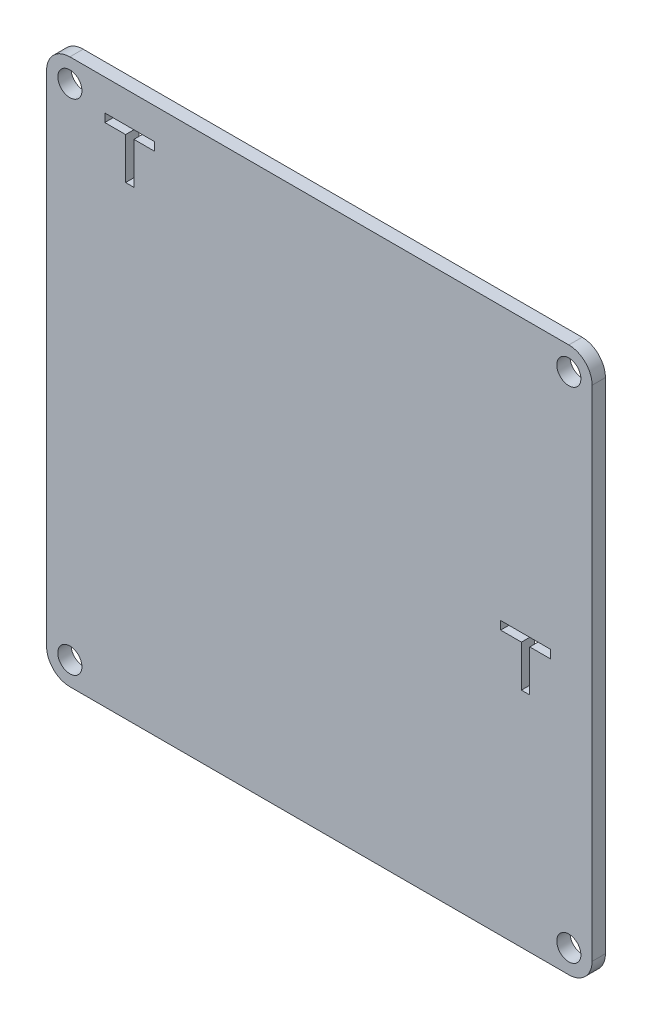
ISO-10303-21;
HEADER;
FILE_DESCRIPTION(('STEP AP214'),'2;1');
FILE_NAME('part.step','',(''),(''),'','','');
FILE_SCHEMA(('AUTOMOTIVE_DESIGN { 1 0 10303 214 1 1 1 1 }'));
ENDSEC;
DATA;
#1=APPLICATION_CONTEXT('core data for automotive mechanical design processes');
#2=APPLICATION_PROTOCOL_DEFINITION('international standard','automotive_design',2000,#1);
#3=PRODUCT_CONTEXT('',#1,'mechanical');
#4=PRODUCT('Part','Part','',(#3));
#5=PRODUCT_RELATED_PRODUCT_CATEGORY('part','',(#4));
#6=PRODUCT_DEFINITION_FORMATION('','',#4);
#7=PRODUCT_DEFINITION_CONTEXT('part definition',#1,'design');
#8=PRODUCT_DEFINITION('design','',#6,#7);
#9=PRODUCT_DEFINITION_SHAPE('','',#8);
#10=(LENGTH_UNIT() NAMED_UNIT(*) SI_UNIT(.MILLI.,.METRE.));
#11=(NAMED_UNIT(*) PLANE_ANGLE_UNIT() SI_UNIT($,.RADIAN.));
#12=(NAMED_UNIT(*) SI_UNIT($,.STERADIAN.) SOLID_ANGLE_UNIT());
#13=UNCERTAINTY_MEASURE_WITH_UNIT(LENGTH_MEASURE(1.E-05),#10,'distance_accuracy_value','');
#14=(GEOMETRIC_REPRESENTATION_CONTEXT(3) GLOBAL_UNCERTAINTY_ASSIGNED_CONTEXT((#13)) GLOBAL_UNIT_ASSIGNED_CONTEXT((#10,
#11,#12)) REPRESENTATION_CONTEXT('',''));
#15=CARTESIAN_POINT('',(0.,0.,0.));
#16=DIRECTION('',(0.,0.,1.));
#17=DIRECTION('',(1.,0.,0.));
#18=AXIS2_PLACEMENT_3D('',#15,#16,#17);
#19=CARTESIAN_POINT('',(30.,30.,1.6));
#20=DIRECTION('',(0.,0.,-1.));
#21=DIRECTION('',(-1.,0.,0.));
#22=AXIS2_PLACEMENT_3D('',#19,#20,#21);
#23=PLANE('',#22);
#24=DIRECTION('',(1.,0.,0.));
#25=VECTOR('',#24,1.);
#26=CARTESIAN_POINT('',(21.8,-1.,1.6));
#27=LINE('',#26,#25);
#28=CARTESIAN_POINT('',(21.8,-1.,1.6));
#29=VERTEX_POINT('',#28);
#30=CARTESIAN_POINT('',(24.3,-1.,1.6));
#31=VERTEX_POINT('',#30);
#32=EDGE_CURVE('E241',#29,#31,#27,.T.);
#33=ORIENTED_EDGE('',*,*,#32,.F.);
#34=DIRECTION('',(0.,-1.,0.));
#35=VECTOR('',#34,1.);
#36=CARTESIAN_POINT('',(21.8,0.,1.6));
#37=LINE('',#36,#35);
#38=CARTESIAN_POINT('',(21.8,0.,1.6));
#39=VERTEX_POINT('',#38);
#40=EDGE_CURVE('E56',#39,#29,#37,.T.);
#41=ORIENTED_EDGE('',*,*,#40,.F.);
#42=DIRECTION('',(-1.,0.,0.));
#43=VECTOR('',#42,1.);
#44=CARTESIAN_POINT('',(21.8,0.,1.6));
#45=LINE('',#44,#43);
#46=CARTESIAN_POINT('',(27.8,0.,1.6));
#47=VERTEX_POINT('',#46);
#48=EDGE_CURVE('E221',#47,#39,#45,.T.);
#49=ORIENTED_EDGE('',*,*,#48,.F.);
#50=DIRECTION('',(0.,1.,0.));
#51=VECTOR('',#50,1.);
#52=CARTESIAN_POINT('',(27.8,0.,1.6));
#53=LINE('',#52,#51);
#54=CARTESIAN_POINT('',(27.8,-1.,1.6));
#55=VERTEX_POINT('',#54);
#56=EDGE_CURVE('E224',#55,#47,#53,.T.);
#57=ORIENTED_EDGE('',*,*,#56,.F.);
#58=DIRECTION('',(1.,0.,0.));
#59=VECTOR('',#58,1.);
#60=CARTESIAN_POINT('',(25.3,-1.,1.6));
#61=LINE('',#60,#59);
#62=CARTESIAN_POINT('',(25.3,-1.,1.6));
#63=VERTEX_POINT('',#62);
#64=EDGE_CURVE('E252',#63,#55,#61,.T.);
#65=ORIENTED_EDGE('',*,*,#64,.F.);
#66=DIRECTION('',(0.,1.,0.));
#67=VECTOR('',#66,1.);
#68=CARTESIAN_POINT('',(25.3,-1.,1.6));
#69=LINE('',#68,#67);
#70=CARTESIAN_POINT('',(25.3,-6.,1.6));
#71=VERTEX_POINT('',#70);
#72=EDGE_CURVE('E249',#71,#63,#69,.T.);
#73=ORIENTED_EDGE('',*,*,#72,.F.);
#74=DIRECTION('',(1.,0.,0.));
#75=VECTOR('',#74,1.);
#76=CARTESIAN_POINT('',(24.3,-6.,1.6));
#77=LINE('',#76,#75);
#78=CARTESIAN_POINT('',(24.3,-6.,1.6));
#79=VERTEX_POINT('',#78);
#80=EDGE_CURVE('E246',#79,#71,#77,.T.);
#81=ORIENTED_EDGE('',*,*,#80,.F.);
#82=DIRECTION('',(0.,-1.,0.));
#83=VECTOR('',#82,1.);
#84=CARTESIAN_POINT('',(24.3,-1.,1.6));
#85=LINE('',#84,#83);
#86=EDGE_CURVE('E243',#31,#79,#85,.T.);
#87=ORIENTED_EDGE('',*,*,#86,.F.);
#88=EDGE_LOOP('',(#33,#41,#49,#57,#65,#73,#81,#87));
#89=FACE_BOUND('',#88,.T.);
#90=DIRECTION('',(1.,0.,0.));
#91=VECTOR('',#90,1.);
#92=CARTESIAN_POINT('',(-25.8,28.06,1.6));
#93=LINE('',#92,#91);
#94=CARTESIAN_POINT('',(-25.8,28.06,1.6));
#95=VERTEX_POINT('',#94);
#96=CARTESIAN_POINT('',(-23.3,28.06,1.6));
#97=VERTEX_POINT('',#96);
#98=EDGE_CURVE('E298',#95,#97,#93,.T.);
#99=ORIENTED_EDGE('',*,*,#98,.F.);
#100=DIRECTION('',(0.,-1.,0.));
#101=VECTOR('',#100,1.);
#102=CARTESIAN_POINT('',(-25.8,29.06,1.6));
#103=LINE('',#102,#101);
#104=CARTESIAN_POINT('',(-25.8,29.06,1.6));
#105=VERTEX_POINT('',#104);
#106=EDGE_CURVE('E259',#105,#95,#103,.T.);
#107=ORIENTED_EDGE('',*,*,#106,.F.);
#108=DIRECTION('',(-1.,0.,0.));
#109=VECTOR('',#108,1.);
#110=CARTESIAN_POINT('',(-25.8,29.06,1.6));
#111=LINE('',#110,#109);
#112=CARTESIAN_POINT('',(-19.8,29.06,1.6));
#113=VERTEX_POINT('',#112);
#114=EDGE_CURVE('E275',#113,#105,#111,.T.);
#115=ORIENTED_EDGE('',*,*,#114,.F.);
#116=DIRECTION('',(0.,1.,0.));
#117=VECTOR('',#116,1.);
#118=CARTESIAN_POINT('',(-19.8,29.06,1.6));
#119=LINE('',#118,#117);
#120=CARTESIAN_POINT('',(-19.8,28.06,1.6));
#121=VERTEX_POINT('',#120);
#122=EDGE_CURVE('E313',#121,#113,#119,.T.);
#123=ORIENTED_EDGE('',*,*,#122,.F.);
#124=DIRECTION('',(1.,0.,0.));
#125=VECTOR('',#124,1.);
#126=CARTESIAN_POINT('',(-22.3,28.06,1.6));
#127=LINE('',#126,#125);
#128=CARTESIAN_POINT('',(-22.3,28.06,1.6));
#129=VERTEX_POINT('',#128);
#130=EDGE_CURVE('E310',#129,#121,#127,.T.);
#131=ORIENTED_EDGE('',*,*,#130,.F.);
#132=DIRECTION('',(0.,1.,0.));
#133=VECTOR('',#132,1.);
#134=CARTESIAN_POINT('',(-22.3,28.06,1.6));
#135=LINE('',#134,#133);
#136=CARTESIAN_POINT('',(-22.3,23.06,1.6));
#137=VERTEX_POINT('',#136);
#138=EDGE_CURVE('E307',#137,#129,#135,.T.);
#139=ORIENTED_EDGE('',*,*,#138,.F.);
#140=DIRECTION('',(1.,0.,0.));
#141=VECTOR('',#140,1.);
#142=CARTESIAN_POINT('',(-23.3,23.06,1.6));
#143=LINE('',#142,#141);
#144=CARTESIAN_POINT('',(-23.3,23.06,1.6));
#145=VERTEX_POINT('',#144);
#146=EDGE_CURVE('E304',#145,#137,#143,.T.);
#147=ORIENTED_EDGE('',*,*,#146,.F.);
#148=DIRECTION('',(0.,-1.,0.));
#149=VECTOR('',#148,1.);
#150=CARTESIAN_POINT('',(-23.3,28.06,1.6));
#151=LINE('',#150,#149);
#152=EDGE_CURVE('E301',#97,#145,#151,.T.);
#153=ORIENTED_EDGE('',*,*,#152,.F.);
#154=EDGE_LOOP('',(#99,#107,#115,#123,#131,#139,#147,#153));
#155=FACE_BOUND('',#154,.T.);
#156=CARTESIAN_POINT('',(30.,30.,1.6));
#157=DIRECTION('',(0.,0.,1.));
#158=DIRECTION('',(-1.,0.,0.));
#159=AXIS2_PLACEMENT_3D('',#156,#157,#158);
#160=CIRCLE('',#159,2.8);
#161=CARTESIAN_POINT('',(32.8,30.,1.6));
#162=VERTEX_POINT('',#161);
#163=CARTESIAN_POINT('',(30.,32.8,1.6));
#164=VERTEX_POINT('',#163);
#165=EDGE_CURVE('E359',#162,#164,#160,.T.);
#166=ORIENTED_EDGE('',*,*,#165,.T.);
#167=DIRECTION('',(-1.,0.,0.));
#168=VECTOR('',#167,1.);
#169=CARTESIAN_POINT('',(-30.,32.8,1.6));
#170=LINE('',#169,#168);
#171=CARTESIAN_POINT('',(-30.,32.8,1.6));
#172=VERTEX_POINT('',#171);
#173=EDGE_CURVE('E362',#164,#172,#170,.T.);
#174=ORIENTED_EDGE('',*,*,#173,.T.);
#175=CARTESIAN_POINT('',(-30.,30.,1.6));
#176=DIRECTION('',(0.,0.,1.));
#177=DIRECTION('',(-1.,0.,0.));
#178=AXIS2_PLACEMENT_3D('',#175,#176,#177);
#179=CIRCLE('',#178,2.8);
#180=CARTESIAN_POINT('',(-32.8,30.,1.6));
#181=VERTEX_POINT('',#180);
#182=EDGE_CURVE('E365',#172,#181,#179,.T.);
#183=ORIENTED_EDGE('',*,*,#182,.T.);
#184=DIRECTION('',(0.,-1.,0.));
#185=VECTOR('',#184,1.);
#186=CARTESIAN_POINT('',(-32.8,-30.,1.6));
#187=LINE('',#186,#185);
#188=CARTESIAN_POINT('',(-32.8,-30.,1.6));
#189=VERTEX_POINT('',#188);
#190=EDGE_CURVE('E367',#181,#189,#187,.T.);
#191=ORIENTED_EDGE('',*,*,#190,.T.);
#192=CARTESIAN_POINT('',(-30.,-30.,1.6));
#193=DIRECTION('',(0.,0.,1.));
#194=DIRECTION('',(-1.,0.,0.));
#195=AXIS2_PLACEMENT_3D('',#192,#193,#194);
#196=CIRCLE('',#195,2.79999999999999);
#197=CARTESIAN_POINT('',(-30.,-32.8,1.6));
#198=VERTEX_POINT('',#197);
#199=EDGE_CURVE('E369',#189,#198,#196,.T.);
#200=ORIENTED_EDGE('',*,*,#199,.T.);
#201=DIRECTION('',(1.,0.,0.));
#202=VECTOR('',#201,1.);
#203=CARTESIAN_POINT('',(30.,-32.8,1.6));
#204=LINE('',#203,#202);
#205=CARTESIAN_POINT('',(30.,-32.8,1.6));
#206=VERTEX_POINT('',#205);
#207=EDGE_CURVE('E371',#198,#206,#204,.T.);
#208=ORIENTED_EDGE('',*,*,#207,.T.);
#209=CARTESIAN_POINT('',(30.,-30.,1.6));
#210=DIRECTION('',(0.,0.,1.));
#211=DIRECTION('',(-1.,0.,0.));
#212=AXIS2_PLACEMENT_3D('',#209,#210,#211);
#213=CIRCLE('',#212,2.79999999999998);
#214=CARTESIAN_POINT('',(32.8,-30.,1.6));
#215=VERTEX_POINT('',#214);
#216=EDGE_CURVE('E373',#206,#215,#213,.T.);
#217=ORIENTED_EDGE('',*,*,#216,.T.);
#218=DIRECTION('',(0.,1.,0.));
#219=VECTOR('',#218,1.);
#220=CARTESIAN_POINT('',(32.8,30.,1.6));
#221=LINE('',#220,#219);
#222=EDGE_CURVE('E375',#215,#162,#221,.T.);
#223=ORIENTED_EDGE('',*,*,#222,.T.);
#224=EDGE_LOOP('',(#166,#174,#183,#191,#200,#208,#217,#223));
#225=FACE_BOUND('',#224,.T.);
#226=CARTESIAN_POINT('',(-30.,30.,1.6));
#227=DIRECTION('',(0.,0.,1.));
#228=DIRECTION('',(1.,0.,0.));
#229=AXIS2_PLACEMENT_3D('',#226,#227,#228);
#230=CIRCLE('',#229,1.45000000000001);
#231=CARTESIAN_POINT('',(-28.55,30.,1.6));
#232=VERTEX_POINT('',#231);
#233=EDGE_CURVE('E353',#232,#232,#230,.T.);
#234=ORIENTED_EDGE('',*,*,#233,.F.);
#235=EDGE_LOOP('',(#234));
#236=FACE_BOUND('',#235,.T.);
#237=CARTESIAN_POINT('',(30.,30.,1.6));
#238=DIRECTION('',(0.,0.,1.));
#239=DIRECTION('',(1.,0.,0.));
#240=AXIS2_PLACEMENT_3D('',#237,#238,#239);
#241=CIRCLE('',#240,1.45);
#242=CARTESIAN_POINT('',(31.45,30.,1.6));
#243=VERTEX_POINT('',#242);
#244=EDGE_CURVE('E347',#243,#243,#241,.T.);
#245=ORIENTED_EDGE('',*,*,#244,.F.);
#246=EDGE_LOOP('',(#245));
#247=FACE_BOUND('',#246,.T.);
#248=CARTESIAN_POINT('',(-30.,-30.,1.6));
#249=DIRECTION('',(0.,0.,1.));
#250=DIRECTION('',(1.,0.,0.));
#251=AXIS2_PLACEMENT_3D('',#248,#249,#250);
#252=CIRCLE('',#251,1.44999999999999);
#253=CARTESIAN_POINT('',(-28.55,-30.,1.6));
#254=VERTEX_POINT('',#253);
#255=EDGE_CURVE('E341',#254,#254,#252,.T.);
#256=ORIENTED_EDGE('',*,*,#255,.F.);
#257=EDGE_LOOP('',(#256));
#258=FACE_BOUND('',#257,.T.);
#259=CARTESIAN_POINT('',(30.,-30.,1.6));
#260=DIRECTION('',(0.,0.,1.));
#261=DIRECTION('',(1.,0.,0.));
#262=AXIS2_PLACEMENT_3D('',#259,#260,#261);
#263=CIRCLE('',#262,1.45);
#264=CARTESIAN_POINT('',(31.45,-30.,1.6));
#265=VERTEX_POINT('',#264);
#266=EDGE_CURVE('E335',#265,#265,#263,.T.);
#267=ORIENTED_EDGE('',*,*,#266,.F.);
#268=EDGE_LOOP('',(#267));
#269=FACE_BOUND('',#268,.T.);
#270=ADVANCED_FACE('F41',(#89,#155,#225,#236,#247,#258,#269),#23,.F.);
#271=CARTESIAN_POINT('',(30.,30.,0.));
#272=DIRECTION('',(0.,0.,-1.));
#273=DIRECTION('',(-1.,0.,0.));
#274=AXIS2_PLACEMENT_3D('',#271,#272,#273);
#275=PLANE('',#274);
#276=DIRECTION('',(0.,-1.,0.));
#277=VECTOR('',#276,1.);
#278=CARTESIAN_POINT('',(21.8,0.,0.));
#279=LINE('',#278,#277);
#280=CARTESIAN_POINT('',(21.8,0.,0.));
#281=VERTEX_POINT('',#280);
#282=CARTESIAN_POINT('',(21.8,-1.,0.));
#283=VERTEX_POINT('',#282);
#284=EDGE_CURVE('E204',#281,#283,#279,.T.);
#285=ORIENTED_EDGE('',*,*,#284,.T.);
#286=DIRECTION('',(1.,0.,0.));
#287=VECTOR('',#286,1.);
#288=CARTESIAN_POINT('',(21.8,-1.,0.));
#289=LINE('',#288,#287);
#290=CARTESIAN_POINT('',(24.3,-1.,0.));
#291=VERTEX_POINT('',#290);
#292=EDGE_CURVE('E213',#283,#291,#289,.T.);
#293=ORIENTED_EDGE('',*,*,#292,.T.);
#294=DIRECTION('',(0.,-1.,0.));
#295=VECTOR('',#294,1.);
#296=CARTESIAN_POINT('',(24.3,-1.,0.));
#297=LINE('',#296,#295);
#298=CARTESIAN_POINT('',(24.3,-6.,0.));
#299=VERTEX_POINT('',#298);
#300=EDGE_CURVE('E64',#291,#299,#297,.T.);
#301=ORIENTED_EDGE('',*,*,#300,.T.);
#302=DIRECTION('',(1.,0.,0.));
#303=VECTOR('',#302,1.);
#304=CARTESIAN_POINT('',(24.3,-6.,0.));
#305=LINE('',#304,#303);
#306=CARTESIAN_POINT('',(25.3,-6.,0.));
#307=VERTEX_POINT('',#306);
#308=EDGE_CURVE('E228',#299,#307,#305,.T.);
#309=ORIENTED_EDGE('',*,*,#308,.T.);
#310=DIRECTION('',(0.,1.,0.));
#311=VECTOR('',#310,1.);
#312=CARTESIAN_POINT('',(25.3,-1.,0.));
#313=LINE('',#312,#311);
#314=CARTESIAN_POINT('',(25.3,-1.,0.));
#315=VERTEX_POINT('',#314);
#316=EDGE_CURVE('E231',#307,#315,#313,.T.);
#317=ORIENTED_EDGE('',*,*,#316,.T.);
#318=DIRECTION('',(1.,0.,0.));
#319=VECTOR('',#318,1.);
#320=CARTESIAN_POINT('',(25.3,-1.,0.));
#321=LINE('',#320,#319);
#322=CARTESIAN_POINT('',(27.8,-1.,0.));
#323=VERTEX_POINT('',#322);
#324=EDGE_CURVE('E234',#315,#323,#321,.T.);
#325=ORIENTED_EDGE('',*,*,#324,.T.);
#326=DIRECTION('',(0.,1.,0.));
#327=VECTOR('',#326,1.);
#328=CARTESIAN_POINT('',(27.8,0.,0.));
#329=LINE('',#328,#327);
#330=CARTESIAN_POINT('',(27.8,0.,0.));
#331=VERTEX_POINT('',#330);
#332=EDGE_CURVE('E237',#323,#331,#329,.T.);
#333=ORIENTED_EDGE('',*,*,#332,.T.);
#334=DIRECTION('',(-1.,0.,0.));
#335=VECTOR('',#334,1.);
#336=CARTESIAN_POINT('',(21.8,0.,0.));
#337=LINE('',#336,#335);
#338=EDGE_CURVE('E210',#331,#281,#337,.T.);
#339=ORIENTED_EDGE('',*,*,#338,.T.);
#340=EDGE_LOOP('',(#285,#293,#301,#309,#317,#325,#333,#339));
#341=FACE_BOUND('',#340,.T.);
#342=DIRECTION('',(0.,-1.,0.));
#343=VECTOR('',#342,1.);
#344=CARTESIAN_POINT('',(-25.8,29.06,0.));
#345=LINE('',#344,#343);
#346=CARTESIAN_POINT('',(-25.8,29.06,0.));
#347=VERTEX_POINT('',#346);
#348=CARTESIAN_POINT('',(-25.8,28.06,0.));
#349=VERTEX_POINT('',#348);
#350=EDGE_CURVE('E271',#347,#349,#345,.T.);
#351=ORIENTED_EDGE('',*,*,#350,.T.);
#352=DIRECTION('',(1.,0.,0.));
#353=VECTOR('',#352,1.);
#354=CARTESIAN_POINT('',(-25.8,28.06,0.));
#355=LINE('',#354,#353);
#356=CARTESIAN_POINT('',(-23.3,28.06,0.));
#357=VERTEX_POINT('',#356);
#358=EDGE_CURVE('E274',#349,#357,#355,.T.);
#359=ORIENTED_EDGE('',*,*,#358,.T.);
#360=DIRECTION('',(0.,-1.,0.));
#361=VECTOR('',#360,1.);
#362=CARTESIAN_POINT('',(-23.3,28.06,0.));
#363=LINE('',#362,#361);
#364=CARTESIAN_POINT('',(-23.3,23.06,0.));
#365=VERTEX_POINT('',#364);
#366=EDGE_CURVE('E278',#357,#365,#363,.T.);
#367=ORIENTED_EDGE('',*,*,#366,.T.);
#368=DIRECTION('',(1.,0.,0.));
#369=VECTOR('',#368,1.);
#370=CARTESIAN_POINT('',(-23.3,23.06,0.));
#371=LINE('',#370,#369);
#372=CARTESIAN_POINT('',(-22.3,23.06,0.));
#373=VERTEX_POINT('',#372);
#374=EDGE_CURVE('E281',#365,#373,#371,.T.);
#375=ORIENTED_EDGE('',*,*,#374,.T.);
#376=DIRECTION('',(0.,1.,0.));
#377=VECTOR('',#376,1.);
#378=CARTESIAN_POINT('',(-22.3,28.06,0.));
#379=LINE('',#378,#377);
#380=CARTESIAN_POINT('',(-22.3,28.06,0.));
#381=VERTEX_POINT('',#380);
#382=EDGE_CURVE('E284',#373,#381,#379,.T.);
#383=ORIENTED_EDGE('',*,*,#382,.T.);
#384=DIRECTION('',(1.,0.,0.));
#385=VECTOR('',#384,1.);
#386=CARTESIAN_POINT('',(-22.3,28.06,0.));
#387=LINE('',#386,#385);
#388=CARTESIAN_POINT('',(-19.8,28.06,0.));
#389=VERTEX_POINT('',#388);
#390=EDGE_CURVE('E287',#381,#389,#387,.T.);
#391=ORIENTED_EDGE('',*,*,#390,.T.);
#392=DIRECTION('',(0.,1.,0.));
#393=VECTOR('',#392,1.);
#394=CARTESIAN_POINT('',(-19.8,29.06,0.));
#395=LINE('',#394,#393);
#396=CARTESIAN_POINT('',(-19.8,29.06,0.));
#397=VERTEX_POINT('',#396);
#398=EDGE_CURVE('E290',#389,#397,#395,.T.);
#399=ORIENTED_EDGE('',*,*,#398,.T.);
#400=DIRECTION('',(-1.,0.,0.));
#401=VECTOR('',#400,1.);
#402=CARTESIAN_POINT('',(-25.8,29.06,0.));
#403=LINE('',#402,#401);
#404=EDGE_CURVE('E293',#397,#347,#403,.T.);
#405=ORIENTED_EDGE('',*,*,#404,.T.);
#406=EDGE_LOOP('',(#351,#359,#367,#375,#383,#391,#399,#405));
#407=FACE_BOUND('',#406,.T.);
#408=CARTESIAN_POINT('',(-30.,-30.,0.));
#409=DIRECTION('',(0.,0.,1.));
#410=DIRECTION('',(1.,0.,0.));
#411=AXIS2_PLACEMENT_3D('',#408,#409,#410);
#412=CIRCLE('',#411,1.44999999999999);
#413=CARTESIAN_POINT('',(-28.55,-30.,0.));
#414=VERTEX_POINT('',#413);
#415=EDGE_CURVE('E338',#414,#414,#412,.T.);
#416=ORIENTED_EDGE('',*,*,#415,.T.);
#417=EDGE_LOOP('',(#416));
#418=FACE_BOUND('',#417,.T.);
#419=CARTESIAN_POINT('',(-30.,30.,0.));
#420=DIRECTION('',(0.,0.,1.));
#421=DIRECTION('',(1.,0.,0.));
#422=AXIS2_PLACEMENT_3D('',#419,#420,#421);
#423=CIRCLE('',#422,1.45000000000001);
#424=CARTESIAN_POINT('',(-28.55,30.,0.));
#425=VERTEX_POINT('',#424);
#426=EDGE_CURVE('E350',#425,#425,#423,.T.);
#427=ORIENTED_EDGE('',*,*,#426,.T.);
#428=EDGE_LOOP('',(#427));
#429=FACE_BOUND('',#428,.T.);
#430=CARTESIAN_POINT('',(30.,30.,0.));
#431=DIRECTION('',(0.,0.,1.));
#432=DIRECTION('',(-1.,0.,0.));
#433=AXIS2_PLACEMENT_3D('',#430,#431,#432);
#434=CIRCLE('',#433,2.8);
#435=CARTESIAN_POINT('',(32.8,30.,0.));
#436=VERTEX_POINT('',#435);
#437=CARTESIAN_POINT('',(30.,32.8,0.));
#438=VERTEX_POINT('',#437);
#439=EDGE_CURVE('E356',#436,#438,#434,.T.);
#440=ORIENTED_EDGE('',*,*,#439,.F.);
#441=DIRECTION('',(0.,1.,0.));
#442=VECTOR('',#441,1.);
#443=CARTESIAN_POINT('',(32.8,30.,0.));
#444=LINE('',#443,#442);
#445=CARTESIAN_POINT('',(32.8,-30.,0.));
#446=VERTEX_POINT('',#445);
#447=EDGE_CURVE('E363',#446,#436,#444,.T.);
#448=ORIENTED_EDGE('',*,*,#447,.F.);
#449=CARTESIAN_POINT('',(30.,-30.,0.));
#450=DIRECTION('',(0.,0.,1.));
#451=DIRECTION('',(-1.,0.,0.));
#452=AXIS2_PLACEMENT_3D('',#449,#450,#451);
#453=CIRCLE('',#452,2.79999999999998);
#454=CARTESIAN_POINT('',(30.,-32.8,0.));
#455=VERTEX_POINT('',#454);
#456=EDGE_CURVE('E390',#455,#446,#453,.T.);
#457=ORIENTED_EDGE('',*,*,#456,.F.);
#458=DIRECTION('',(1.,0.,0.));
#459=VECTOR('',#458,1.);
#460=CARTESIAN_POINT('',(30.,-32.8,0.));
#461=LINE('',#460,#459);
#462=CARTESIAN_POINT('',(-30.,-32.8,0.));
#463=VERTEX_POINT('',#462);
#464=EDGE_CURVE('E388',#463,#455,#461,.T.);
#465=ORIENTED_EDGE('',*,*,#464,.F.);
#466=CARTESIAN_POINT('',(-30.,-30.,0.));
#467=DIRECTION('',(0.,0.,1.));
#468=DIRECTION('',(-1.,0.,0.));
#469=AXIS2_PLACEMENT_3D('',#466,#467,#468);
#470=CIRCLE('',#469,2.79999999999999);
#471=CARTESIAN_POINT('',(-32.8,-30.,0.));
#472=VERTEX_POINT('',#471);
#473=EDGE_CURVE('E386',#472,#463,#470,.T.);
#474=ORIENTED_EDGE('',*,*,#473,.F.);
#475=DIRECTION('',(0.,-1.,0.));
#476=VECTOR('',#475,1.);
#477=CARTESIAN_POINT('',(-32.8,-30.,0.));
#478=LINE('',#477,#476);
#479=CARTESIAN_POINT('',(-32.8,30.,0.));
#480=VERTEX_POINT('',#479);
#481=EDGE_CURVE('E384',#480,#472,#478,.T.);
#482=ORIENTED_EDGE('',*,*,#481,.F.);
#483=CARTESIAN_POINT('',(-30.,30.,0.));
#484=DIRECTION('',(0.,0.,1.));
#485=DIRECTION('',(-1.,0.,0.));
#486=AXIS2_PLACEMENT_3D('',#483,#484,#485);
#487=CIRCLE('',#486,2.8);
#488=CARTESIAN_POINT('',(-30.,32.8,0.));
#489=VERTEX_POINT('',#488);
#490=EDGE_CURVE('E382',#489,#480,#487,.T.);
#491=ORIENTED_EDGE('',*,*,#490,.F.);
#492=DIRECTION('',(-1.,0.,0.));
#493=VECTOR('',#492,1.);
#494=CARTESIAN_POINT('',(-30.,32.8,0.));
#495=LINE('',#494,#493);
#496=EDGE_CURVE('E380',#438,#489,#495,.T.);
#497=ORIENTED_EDGE('',*,*,#496,.F.);
#498=EDGE_LOOP('',(#440,#448,#457,#465,#474,#482,#491,#497));
#499=FACE_BOUND('',#498,.T.);
#500=CARTESIAN_POINT('',(30.,30.,0.));
#501=DIRECTION('',(0.,0.,1.));
#502=DIRECTION('',(1.,0.,0.));
#503=AXIS2_PLACEMENT_3D('',#500,#501,#502);
#504=CIRCLE('',#503,1.45);
#505=CARTESIAN_POINT('',(31.45,30.,0.));
#506=VERTEX_POINT('',#505);
#507=EDGE_CURVE('E344',#506,#506,#504,.T.);
#508=ORIENTED_EDGE('',*,*,#507,.T.);
#509=EDGE_LOOP('',(#508));
#510=FACE_BOUND('',#509,.T.);
#511=CARTESIAN_POINT('',(30.,-30.,0.));
#512=DIRECTION('',(0.,0.,1.));
#513=DIRECTION('',(1.,0.,0.));
#514=AXIS2_PLACEMENT_3D('',#511,#512,#513);
#515=CIRCLE('',#514,1.45);
#516=CARTESIAN_POINT('',(31.45,-30.,0.));
#517=VERTEX_POINT('',#516);
#518=EDGE_CURVE('E320',#517,#517,#515,.T.);
#519=ORIENTED_EDGE('',*,*,#518,.T.);
#520=EDGE_LOOP('',(#519));
#521=FACE_BOUND('',#520,.T.);
#522=ADVANCED_FACE('F217',(#341,#407,#418,#429,#499,#510,#521),#275,.T.);
#523=CARTESIAN_POINT('',(30.,30.,1.6));
#524=DIRECTION('',(0.,0.,-1.));
#525=DIRECTION('',(-1.,0.,0.));
#526=AXIS2_PLACEMENT_3D('',#523,#524,#525);
#527=CYLINDRICAL_SURFACE('',#526,2.8);
#528=ORIENTED_EDGE('',*,*,#439,.T.);
#529=DIRECTION('',(0.,0.,-1.));
#530=VECTOR('',#529,1.);
#531=CARTESIAN_POINT('',(30.,32.8,1.6));
#532=LINE('',#531,#530);
#533=EDGE_CURVE('E11',#164,#438,#532,.T.);
#534=ORIENTED_EDGE('',*,*,#533,.F.);
#535=ORIENTED_EDGE('',*,*,#165,.F.);
#536=DIRECTION('',(0.,0.,-1.));
#537=VECTOR('',#536,1.);
#538=CARTESIAN_POINT('',(32.8,30.,1.6));
#539=LINE('',#538,#537);
#540=EDGE_CURVE('E377',#162,#436,#539,.T.);
#541=ORIENTED_EDGE('',*,*,#540,.T.);
#542=EDGE_LOOP('',(#528,#534,#535,#541));
#543=FACE_BOUND('',#542,.T.);
#544=ADVANCED_FACE('F43',(#543),#527,.T.);
#545=CARTESIAN_POINT('',(-30.,32.8,1.6));
#546=DIRECTION('',(0.,-1.,0.));
#547=DIRECTION('',(0.,0.,-1.));
#548=AXIS2_PLACEMENT_3D('',#545,#546,#547);
#549=PLANE('',#548);
#550=ORIENTED_EDGE('',*,*,#496,.T.);
#551=DIRECTION('',(0.,0.,-1.));
#552=VECTOR('',#551,1.);
#553=CARTESIAN_POINT('',(-30.,32.8,1.6));
#554=LINE('',#553,#552);
#555=EDGE_CURVE('E49',#172,#489,#554,.T.);
#556=ORIENTED_EDGE('',*,*,#555,.F.);
#557=ORIENTED_EDGE('',*,*,#173,.F.);
#558=ORIENTED_EDGE('',*,*,#533,.T.);
#559=EDGE_LOOP('',(#550,#556,#557,#558));
#560=FACE_BOUND('',#559,.T.);
#561=ADVANCED_FACE('F437',(#560),#549,.F.);
#562=CARTESIAN_POINT('',(-30.,30.,1.6));
#563=DIRECTION('',(0.,0.,-1.));
#564=DIRECTION('',(-1.,0.,0.));
#565=AXIS2_PLACEMENT_3D('',#562,#563,#564);
#566=CYLINDRICAL_SURFACE('',#565,2.8);
#567=ORIENTED_EDGE('',*,*,#490,.T.);
#568=DIRECTION('',(0.,0.,-1.));
#569=VECTOR('',#568,1.);
#570=CARTESIAN_POINT('',(-32.8,30.,1.6));
#571=LINE('',#570,#569);
#572=EDGE_CURVE('E407',#181,#480,#571,.T.);
#573=ORIENTED_EDGE('',*,*,#572,.F.);
#574=ORIENTED_EDGE('',*,*,#182,.F.);
#575=ORIENTED_EDGE('',*,*,#555,.T.);
#576=EDGE_LOOP('',(#567,#573,#574,#575));
#577=FACE_BOUND('',#576,.T.);
#578=ADVANCED_FACE('F414',(#577),#566,.T.);
#579=CARTESIAN_POINT('',(-32.8,-30.,1.6));
#580=DIRECTION('',(1.,0.,0.));
#581=DIRECTION('',(0.,1.,0.));
#582=AXIS2_PLACEMENT_3D('',#579,#580,#581);
#583=PLANE('',#582);
#584=ORIENTED_EDGE('',*,*,#481,.T.);
#585=DIRECTION('',(0.,0.,-1.));
#586=VECTOR('',#585,1.);
#587=CARTESIAN_POINT('',(-32.8,-30.,1.6));
#588=LINE('',#587,#586);
#589=EDGE_CURVE('E404',#189,#472,#588,.T.);
#590=ORIENTED_EDGE('',*,*,#589,.F.);
#591=ORIENTED_EDGE('',*,*,#190,.F.);
#592=ORIENTED_EDGE('',*,*,#572,.T.);
#593=EDGE_LOOP('',(#584,#590,#591,#592));
#594=FACE_BOUND('',#593,.T.);
#595=ADVANCED_FACE('F425',(#594),#583,.F.);
#596=CARTESIAN_POINT('',(-30.,-30.,1.6));
#597=DIRECTION('',(0.,0.,-1.));
#598=DIRECTION('',(-1.,0.,0.));
#599=AXIS2_PLACEMENT_3D('',#596,#597,#598);
#600=CYLINDRICAL_SURFACE('',#599,2.79999999999999);
#601=ORIENTED_EDGE('',*,*,#473,.T.);
#602=DIRECTION('',(0.,0.,-1.));
#603=VECTOR('',#602,1.);
#604=CARTESIAN_POINT('',(-30.,-32.8,1.6));
#605=LINE('',#604,#603);
#606=EDGE_CURVE('E401',#198,#463,#605,.T.);
#607=ORIENTED_EDGE('',*,*,#606,.F.);
#608=ORIENTED_EDGE('',*,*,#199,.F.);
#609=ORIENTED_EDGE('',*,*,#589,.T.);
#610=EDGE_LOOP('',(#601,#607,#608,#609));
#611=FACE_BOUND('',#610,.T.);
#612=ADVANCED_FACE('F429',(#611),#600,.T.);
#613=CARTESIAN_POINT('',(30.,-32.8,1.6));
#614=DIRECTION('',(0.,1.,0.));
#615=DIRECTION('',(-1.,0.,0.));
#616=AXIS2_PLACEMENT_3D('',#613,#614,#615);
#617=PLANE('',#616);
#618=ORIENTED_EDGE('',*,*,#464,.T.);
#619=DIRECTION('',(0.,0.,-1.));
#620=VECTOR('',#619,1.);
#621=CARTESIAN_POINT('',(30.,-32.8,1.6));
#622=LINE('',#621,#620);
#623=EDGE_CURVE('E398',#206,#455,#622,.T.);
#624=ORIENTED_EDGE('',*,*,#623,.F.);
#625=ORIENTED_EDGE('',*,*,#207,.F.);
#626=ORIENTED_EDGE('',*,*,#606,.T.);
#627=EDGE_LOOP('',(#618,#624,#625,#626));
#628=FACE_BOUND('',#627,.T.);
#629=ADVANCED_FACE('F450',(#628),#617,.F.);
#630=CARTESIAN_POINT('',(30.,-30.,1.6));
#631=DIRECTION('',(0.,0.,-1.));
#632=DIRECTION('',(-1.,0.,0.));
#633=AXIS2_PLACEMENT_3D('',#630,#631,#632);
#634=CYLINDRICAL_SURFACE('',#633,2.79999999999998);
#635=ORIENTED_EDGE('',*,*,#456,.T.);
#636=DIRECTION('',(0.,0.,-1.));
#637=VECTOR('',#636,1.);
#638=CARTESIAN_POINT('',(32.8,-30.,1.6));
#639=LINE('',#638,#637);
#640=EDGE_CURVE('E395',#215,#446,#639,.T.);
#641=ORIENTED_EDGE('',*,*,#640,.F.);
#642=ORIENTED_EDGE('',*,*,#216,.F.);
#643=ORIENTED_EDGE('',*,*,#623,.T.);
#644=EDGE_LOOP('',(#635,#641,#642,#643));
#645=FACE_BOUND('',#644,.T.);
#646=ADVANCED_FACE('F448',(#645),#634,.T.);
#647=CARTESIAN_POINT('',(32.8,30.,1.6));
#648=DIRECTION('',(-1.,0.,0.));
#649=DIRECTION('',(0.,-1.,0.));
#650=AXIS2_PLACEMENT_3D('',#647,#648,#649);
#651=PLANE('',#650);
#652=ORIENTED_EDGE('',*,*,#447,.T.);
#653=ORIENTED_EDGE('',*,*,#540,.F.);
#654=ORIENTED_EDGE('',*,*,#222,.F.);
#655=ORIENTED_EDGE('',*,*,#640,.T.);
#656=EDGE_LOOP('',(#652,#653,#654,#655));
#657=FACE_BOUND('',#656,.T.);
#658=ADVANCED_FACE('F443',(#657),#651,.F.);
#659=CARTESIAN_POINT('',(-30.,30.,1.6));
#660=DIRECTION('',(0.,0.,-1.));
#661=DIRECTION('',(-1.,0.,0.));
#662=AXIS2_PLACEMENT_3D('',#659,#660,#661);
#663=CYLINDRICAL_SURFACE('',#662,1.45000000000001);
#664=ORIENTED_EDGE('',*,*,#233,.T.);
#665=EDGE_LOOP('',(#664));
#666=FACE_BOUND('',#665,.T.);
#667=ORIENTED_EDGE('',*,*,#426,.F.);
#668=EDGE_LOOP('',(#667));
#669=FACE_BOUND('',#668,.T.);
#670=ADVANCED_FACE('F469',(#666,#669),#663,.F.);
#671=CARTESIAN_POINT('',(30.,30.,1.6));
#672=DIRECTION('',(0.,0.,-1.));
#673=DIRECTION('',(-1.,0.,0.));
#674=AXIS2_PLACEMENT_3D('',#671,#672,#673);
#675=CYLINDRICAL_SURFACE('',#674,1.45);
#676=ORIENTED_EDGE('',*,*,#244,.T.);
#677=EDGE_LOOP('',(#676));
#678=FACE_BOUND('',#677,.T.);
#679=ORIENTED_EDGE('',*,*,#507,.F.);
#680=EDGE_LOOP('',(#679));
#681=FACE_BOUND('',#680,.T.);
#682=ADVANCED_FACE('F476',(#678,#681),#675,.F.);
#683=CARTESIAN_POINT('',(-30.,-30.,1.6));
#684=DIRECTION('',(0.,0.,-1.));
#685=DIRECTION('',(-1.,0.,0.));
#686=AXIS2_PLACEMENT_3D('',#683,#684,#685);
#687=CYLINDRICAL_SURFACE('',#686,1.44999999999999);
#688=ORIENTED_EDGE('',*,*,#255,.T.);
#689=EDGE_LOOP('',(#688));
#690=FACE_BOUND('',#689,.T.);
#691=ORIENTED_EDGE('',*,*,#415,.F.);
#692=EDGE_LOOP('',(#691));
#693=FACE_BOUND('',#692,.T.);
#694=ADVANCED_FACE('F481',(#690,#693),#687,.F.);
#695=CARTESIAN_POINT('',(30.,-30.,1.6));
#696=DIRECTION('',(0.,0.,-1.));
#697=DIRECTION('',(-1.,0.,0.));
#698=AXIS2_PLACEMENT_3D('',#695,#696,#697);
#699=CYLINDRICAL_SURFACE('',#698,1.45);
#700=ORIENTED_EDGE('',*,*,#266,.T.);
#701=EDGE_LOOP('',(#700));
#702=FACE_BOUND('',#701,.T.);
#703=ORIENTED_EDGE('',*,*,#518,.F.);
#704=EDGE_LOOP('',(#703));
#705=FACE_BOUND('',#704,.T.);
#706=ADVANCED_FACE('F494',(#702,#705),#699,.F.);
#707=CARTESIAN_POINT('',(-25.8,29.06,0.));
#708=DIRECTION('',(-1.,0.,0.));
#709=DIRECTION('',(0.,0.,1.));
#710=AXIS2_PLACEMENT_3D('',#707,#708,#709);
#711=PLANE('',#710);
#712=ORIENTED_EDGE('',*,*,#106,.T.);
#713=DIRECTION('',(0.,0.,1.));
#714=VECTOR('',#713,1.);
#715=CARTESIAN_POINT('',(-25.8,28.06,0.));
#716=LINE('',#715,#714);
#717=EDGE_CURVE('E296',#349,#95,#716,.T.);
#718=ORIENTED_EDGE('',*,*,#717,.F.);
#719=ORIENTED_EDGE('',*,*,#350,.F.);
#720=DIRECTION('',(0.,0.,1.));
#721=VECTOR('',#720,1.);
#722=CARTESIAN_POINT('',(-25.8,29.06,0.));
#723=LINE('',#722,#721);
#724=EDGE_CURVE('E318',#347,#105,#723,.T.);
#725=ORIENTED_EDGE('',*,*,#724,.T.);
#726=EDGE_LOOP('',(#712,#718,#719,#725));
#727=FACE_BOUND('',#726,.T.);
#728=ADVANCED_FACE('F497',(#727),#711,.F.);
#729=CARTESIAN_POINT('',(-25.8,29.06,0.));
#730=DIRECTION('',(0.,1.,0.));
#731=DIRECTION('',(0.,0.,1.));
#732=AXIS2_PLACEMENT_3D('',#729,#730,#731);
#733=PLANE('',#732);
#734=ORIENTED_EDGE('',*,*,#114,.T.);
#735=ORIENTED_EDGE('',*,*,#724,.F.);
#736=ORIENTED_EDGE('',*,*,#404,.F.);
#737=DIRECTION('',(0.,0.,1.));
#738=VECTOR('',#737,1.);
#739=CARTESIAN_POINT('',(-19.8,29.06,0.));
#740=LINE('',#739,#738);
#741=EDGE_CURVE('E321',#397,#113,#740,.T.);
#742=ORIENTED_EDGE('',*,*,#741,.T.);
#743=EDGE_LOOP('',(#734,#735,#736,#742));
#744=FACE_BOUND('',#743,.T.);
#745=ADVANCED_FACE('F505',(#744),#733,.F.);
#746=CARTESIAN_POINT('',(-19.8,29.06,0.));
#747=DIRECTION('',(1.,0.,0.));
#748=DIRECTION('',(0.,0.,-1.));
#749=AXIS2_PLACEMENT_3D('',#746,#747,#748);
#750=PLANE('',#749);
#751=ORIENTED_EDGE('',*,*,#122,.T.);
#752=ORIENTED_EDGE('',*,*,#741,.F.);
#753=ORIENTED_EDGE('',*,*,#398,.F.);
#754=DIRECTION('',(0.,0.,1.));
#755=VECTOR('',#754,1.);
#756=CARTESIAN_POINT('',(-19.8,28.06,0.));
#757=LINE('',#756,#755);
#758=EDGE_CURVE('E323',#389,#121,#757,.T.);
#759=ORIENTED_EDGE('',*,*,#758,.T.);
#760=EDGE_LOOP('',(#751,#752,#753,#759));
#761=FACE_BOUND('',#760,.T.);
#762=ADVANCED_FACE('F529',(#761),#750,.F.);
#763=CARTESIAN_POINT('',(-22.3,28.06,0.));
#764=DIRECTION('',(0.,-1.,0.));
#765=DIRECTION('',(1.,0.,0.));
#766=AXIS2_PLACEMENT_3D('',#763,#764,#765);
#767=PLANE('',#766);
#768=ORIENTED_EDGE('',*,*,#130,.T.);
#769=ORIENTED_EDGE('',*,*,#758,.F.);
#770=ORIENTED_EDGE('',*,*,#390,.F.);
#771=DIRECTION('',(0.,0.,1.));
#772=VECTOR('',#771,1.);
#773=CARTESIAN_POINT('',(-22.3,28.06,0.));
#774=LINE('',#773,#772);
#775=EDGE_CURVE('E325',#381,#129,#774,.T.);
#776=ORIENTED_EDGE('',*,*,#775,.T.);
#777=EDGE_LOOP('',(#768,#769,#770,#776));
#778=FACE_BOUND('',#777,.T.);
#779=ADVANCED_FACE('F525',(#778),#767,.F.);
#780=CARTESIAN_POINT('',(-22.3,28.06,0.));
#781=DIRECTION('',(1.,0.,0.));
#782=DIRECTION('',(0.,0.,-1.));
#783=AXIS2_PLACEMENT_3D('',#780,#781,#782);
#784=PLANE('',#783);
#785=ORIENTED_EDGE('',*,*,#138,.T.);
#786=ORIENTED_EDGE('',*,*,#775,.F.);
#787=ORIENTED_EDGE('',*,*,#382,.F.);
#788=DIRECTION('',(0.,0.,1.));
#789=VECTOR('',#788,1.);
#790=CARTESIAN_POINT('',(-22.3,23.06,0.));
#791=LINE('',#790,#789);
#792=EDGE_CURVE('E327',#373,#137,#791,.T.);
#793=ORIENTED_EDGE('',*,*,#792,.T.);
#794=EDGE_LOOP('',(#785,#786,#787,#793));
#795=FACE_BOUND('',#794,.T.);
#796=ADVANCED_FACE('F521',(#795),#784,.F.);
#797=CARTESIAN_POINT('',(-23.3,23.06,0.));
#798=DIRECTION('',(0.,-1.,0.));
#799=DIRECTION('',(0.,0.,-1.));
#800=AXIS2_PLACEMENT_3D('',#797,#798,#799);
#801=PLANE('',#800);
#802=ORIENTED_EDGE('',*,*,#146,.T.);
#803=ORIENTED_EDGE('',*,*,#792,.F.);
#804=ORIENTED_EDGE('',*,*,#374,.F.);
#805=DIRECTION('',(0.,0.,1.));
#806=VECTOR('',#805,1.);
#807=CARTESIAN_POINT('',(-23.3,23.06,0.));
#808=LINE('',#807,#806);
#809=EDGE_CURVE('E329',#365,#145,#808,.T.);
#810=ORIENTED_EDGE('',*,*,#809,.T.);
#811=EDGE_LOOP('',(#802,#803,#804,#810));
#812=FACE_BOUND('',#811,.T.);
#813=ADVANCED_FACE('F517',(#812),#801,.F.);
#814=CARTESIAN_POINT('',(-23.3,28.06,0.));
#815=DIRECTION('',(-1.,0.,0.));
#816=DIRECTION('',(0.,0.,1.));
#817=AXIS2_PLACEMENT_3D('',#814,#815,#816);
#818=PLANE('',#817);
#819=ORIENTED_EDGE('',*,*,#152,.T.);
#820=ORIENTED_EDGE('',*,*,#809,.F.);
#821=ORIENTED_EDGE('',*,*,#366,.F.);
#822=DIRECTION('',(0.,0.,1.));
#823=VECTOR('',#822,1.);
#824=CARTESIAN_POINT('',(-23.3,28.06,0.));
#825=LINE('',#824,#823);
#826=EDGE_CURVE('E331',#357,#97,#825,.T.);
#827=ORIENTED_EDGE('',*,*,#826,.T.);
#828=EDGE_LOOP('',(#819,#820,#821,#827));
#829=FACE_BOUND('',#828,.T.);
#830=ADVANCED_FACE('F513',(#829),#818,.F.);
#831=CARTESIAN_POINT('',(-25.8,28.06,0.));
#832=DIRECTION('',(0.,-1.,0.));
#833=DIRECTION('',(0.,0.,-1.));
#834=AXIS2_PLACEMENT_3D('',#831,#832,#833);
#835=PLANE('',#834);
#836=ORIENTED_EDGE('',*,*,#98,.T.);
#837=ORIENTED_EDGE('',*,*,#826,.F.);
#838=ORIENTED_EDGE('',*,*,#358,.F.);
#839=ORIENTED_EDGE('',*,*,#717,.T.);
#840=EDGE_LOOP('',(#836,#837,#838,#839));
#841=FACE_BOUND('',#840,.T.);
#842=ADVANCED_FACE('F511',(#841),#835,.F.);
#843=CARTESIAN_POINT('',(21.8,0.,0.));
#844=DIRECTION('',(-1.,0.,0.));
#845=DIRECTION('',(0.,0.,1.));
#846=AXIS2_PLACEMENT_3D('',#843,#844,#845);
#847=PLANE('',#846);
#848=ORIENTED_EDGE('',*,*,#40,.T.);
#849=DIRECTION('',(0.,0.,1.));
#850=VECTOR('',#849,1.);
#851=CARTESIAN_POINT('',(21.8,-1.,0.));
#852=LINE('',#851,#850);
#853=EDGE_CURVE('E200',#283,#29,#852,.T.);
#854=ORIENTED_EDGE('',*,*,#853,.F.);
#855=ORIENTED_EDGE('',*,*,#284,.F.);
#856=DIRECTION('',(0.,0.,1.));
#857=VECTOR('',#856,1.);
#858=CARTESIAN_POINT('',(21.8,0.,0.));
#859=LINE('',#858,#857);
#860=EDGE_CURVE('E257',#281,#39,#859,.T.);
#861=ORIENTED_EDGE('',*,*,#860,.T.);
#862=EDGE_LOOP('',(#848,#854,#855,#861));
#863=FACE_BOUND('',#862,.T.);
#864=ADVANCED_FACE('F202',(#863),#847,.F.);
#865=CARTESIAN_POINT('',(21.8,0.,0.));
#866=DIRECTION('',(0.,1.,0.));
#867=DIRECTION('',(0.,0.,1.));
#868=AXIS2_PLACEMENT_3D('',#865,#866,#867);
#869=PLANE('',#868);
#870=ORIENTED_EDGE('',*,*,#48,.T.);
#871=ORIENTED_EDGE('',*,*,#860,.F.);
#872=ORIENTED_EDGE('',*,*,#338,.F.);
#873=DIRECTION('',(0.,0.,1.));
#874=VECTOR('',#873,1.);
#875=CARTESIAN_POINT('',(27.8,0.,0.));
#876=LINE('',#875,#874);
#877=EDGE_CURVE('E260',#331,#47,#876,.T.);
#878=ORIENTED_EDGE('',*,*,#877,.T.);
#879=EDGE_LOOP('',(#870,#871,#872,#878));
#880=FACE_BOUND('',#879,.T.);
#881=ADVANCED_FACE('F539',(#880),#869,.F.);
#882=CARTESIAN_POINT('',(27.8,0.,0.));
#883=DIRECTION('',(1.,0.,0.));
#884=DIRECTION('',(0.,1.,0.));
#885=AXIS2_PLACEMENT_3D('',#882,#883,#884);
#886=PLANE('',#885);
#887=ORIENTED_EDGE('',*,*,#56,.T.);
#888=ORIENTED_EDGE('',*,*,#877,.F.);
#889=ORIENTED_EDGE('',*,*,#332,.F.);
#890=DIRECTION('',(0.,0.,1.));
#891=VECTOR('',#890,1.);
#892=CARTESIAN_POINT('',(27.8,-1.,0.));
#893=LINE('',#892,#891);
#894=EDGE_CURVE('E262',#323,#55,#893,.T.);
#895=ORIENTED_EDGE('',*,*,#894,.T.);
#896=EDGE_LOOP('',(#887,#888,#889,#895));
#897=FACE_BOUND('',#896,.T.);
#898=ADVANCED_FACE('F556',(#897),#886,.F.);
#899=CARTESIAN_POINT('',(25.3,-1.,0.));
#900=DIRECTION('',(0.,-1.,0.));
#901=DIRECTION('',(0.,0.,-1.));
#902=AXIS2_PLACEMENT_3D('',#899,#900,#901);
#903=PLANE('',#902);
#904=ORIENTED_EDGE('',*,*,#64,.T.);
#905=ORIENTED_EDGE('',*,*,#894,.F.);
#906=ORIENTED_EDGE('',*,*,#324,.F.);
#907=DIRECTION('',(0.,0.,1.));
#908=VECTOR('',#907,1.);
#909=CARTESIAN_POINT('',(25.3,-1.,0.));
#910=LINE('',#909,#908);
#911=EDGE_CURVE('E264',#315,#63,#910,.T.);
#912=ORIENTED_EDGE('',*,*,#911,.T.);
#913=EDGE_LOOP('',(#904,#905,#906,#912));
#914=FACE_BOUND('',#913,.T.);
#915=ADVANCED_FACE('F552',(#914),#903,.F.);
#916=CARTESIAN_POINT('',(25.3,-1.,0.));
#917=DIRECTION('',(1.,0.,0.));
#918=DIRECTION('',(0.,1.,0.));
#919=AXIS2_PLACEMENT_3D('',#916,#917,#918);
#920=PLANE('',#919);
#921=ORIENTED_EDGE('',*,*,#72,.T.);
#922=ORIENTED_EDGE('',*,*,#911,.F.);
#923=ORIENTED_EDGE('',*,*,#316,.F.);
#924=DIRECTION('',(0.,0.,1.));
#925=VECTOR('',#924,1.);
#926=CARTESIAN_POINT('',(25.3,-6.,0.));
#927=LINE('',#926,#925);
#928=EDGE_CURVE('E266',#307,#71,#927,.T.);
#929=ORIENTED_EDGE('',*,*,#928,.T.);
#930=EDGE_LOOP('',(#921,#922,#923,#929));
#931=FACE_BOUND('',#930,.T.);
#932=ADVANCED_FACE('F548',(#931),#920,.F.);
#933=CARTESIAN_POINT('',(24.3,-6.,0.));
#934=DIRECTION('',(0.,-1.,0.));
#935=DIRECTION('',(1.,0.,0.));
#936=AXIS2_PLACEMENT_3D('',#933,#934,#935);
#937=PLANE('',#936);
#938=ORIENTED_EDGE('',*,*,#80,.T.);
#939=ORIENTED_EDGE('',*,*,#928,.F.);
#940=ORIENTED_EDGE('',*,*,#308,.F.);
#941=DIRECTION('',(0.,0.,1.));
#942=VECTOR('',#941,1.);
#943=CARTESIAN_POINT('',(24.3,-6.,0.));
#944=LINE('',#943,#942);
#945=EDGE_CURVE('E268',#299,#79,#944,.T.);
#946=ORIENTED_EDGE('',*,*,#945,.T.);
#947=EDGE_LOOP('',(#938,#939,#940,#946));
#948=FACE_BOUND('',#947,.T.);
#949=ADVANCED_FACE('F545',(#948),#937,.F.);
#950=CARTESIAN_POINT('',(24.3,-1.,0.));
#951=DIRECTION('',(-1.,0.,0.));
#952=DIRECTION('',(0.,0.,1.));
#953=AXIS2_PLACEMENT_3D('',#950,#951,#952);
#954=PLANE('',#953);
#955=ORIENTED_EDGE('',*,*,#86,.T.);
#956=ORIENTED_EDGE('',*,*,#945,.F.);
#957=ORIENTED_EDGE('',*,*,#300,.F.);
#958=DIRECTION('',(0.,0.,1.));
#959=VECTOR('',#958,1.);
#960=CARTESIAN_POINT('',(24.3,-1.,0.));
#961=LINE('',#960,#959);
#962=EDGE_CURVE('E209',#291,#31,#961,.T.);
#963=ORIENTED_EDGE('',*,*,#962,.T.);
#964=EDGE_LOOP('',(#955,#956,#957,#963));
#965=FACE_BOUND('',#964,.T.);
#966=ADVANCED_FACE('F542',(#965),#954,.F.);
#967=CARTESIAN_POINT('',(21.8,-1.,0.));
#968=DIRECTION('',(0.,-1.,0.));
#969=DIRECTION('',(0.,0.,-1.));
#970=AXIS2_PLACEMENT_3D('',#967,#968,#969);
#971=PLANE('',#970);
#972=ORIENTED_EDGE('',*,*,#32,.T.);
#973=ORIENTED_EDGE('',*,*,#962,.F.);
#974=ORIENTED_EDGE('',*,*,#292,.F.);
#975=ORIENTED_EDGE('',*,*,#853,.T.);
#976=EDGE_LOOP('',(#972,#973,#974,#975));
#977=FACE_BOUND('',#976,.T.);
#978=ADVANCED_FACE('F214',(#977),#971,.F.);
#979=CLOSED_SHELL('',(#270,#522,#544,#561,#578,#595,#612,#629,#646,#658,#670,#682,#694,#706,
#728,#745,#762,#779,#796,#813,#830,#842,#864,#881,#898,#915,#932,#949,#966,#978));
#980=MANIFOLD_SOLID_BREP('B2',#979);
#981=ADVANCED_BREP_SHAPE_REPRESENTATION('',(#18,#980),#14);
#982=SHAPE_DEFINITION_REPRESENTATION(#9,#981);
ENDSEC;
END-ISO-10303-21;
